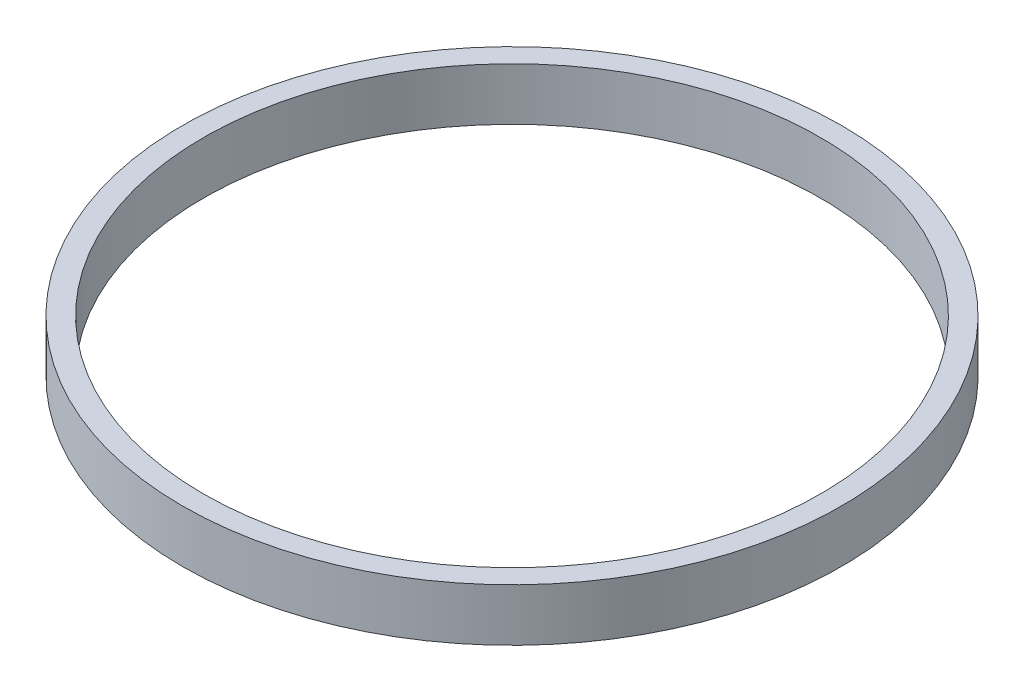
ISO-10303-21;
HEADER;
FILE_DESCRIPTION(('STEP AP214'),'2;1');
FILE_NAME('part.step','',(''),(''),'','','');
FILE_SCHEMA(('AUTOMOTIVE_DESIGN { 1 0 10303 214 1 1 1 1 }'));
ENDSEC;
DATA;
#1=APPLICATION_CONTEXT('core data for automotive mechanical design processes');
#2=APPLICATION_PROTOCOL_DEFINITION('international standard','automotive_design',2000,#1);
#3=PRODUCT_CONTEXT('',#1,'mechanical');
#4=PRODUCT('Part','Part','',(#3));
#5=PRODUCT_RELATED_PRODUCT_CATEGORY('part','',(#4));
#6=PRODUCT_DEFINITION_FORMATION('','',#4);
#7=PRODUCT_DEFINITION_CONTEXT('part definition',#1,'design');
#8=PRODUCT_DEFINITION('design','',#6,#7);
#9=PRODUCT_DEFINITION_SHAPE('','',#8);
#10=(LENGTH_UNIT() NAMED_UNIT(*) SI_UNIT(.MILLI.,.METRE.));
#11=(NAMED_UNIT(*) PLANE_ANGLE_UNIT() SI_UNIT($,.RADIAN.));
#12=(NAMED_UNIT(*) SI_UNIT($,.STERADIAN.) SOLID_ANGLE_UNIT());
#13=UNCERTAINTY_MEASURE_WITH_UNIT(LENGTH_MEASURE(1.E-05),#10,'distance_accuracy_value','');
#14=(GEOMETRIC_REPRESENTATION_CONTEXT(3) GLOBAL_UNCERTAINTY_ASSIGNED_CONTEXT((#13)) GLOBAL_UNIT_ASSIGNED_CONTEXT((#10,
#11,#12)) REPRESENTATION_CONTEXT('',''));
#15=CARTESIAN_POINT('',(0.,0.,0.));
#16=DIRECTION('',(0.,0.,1.));
#17=DIRECTION('',(1.,0.,0.));
#18=AXIS2_PLACEMENT_3D('',#15,#16,#17);
#19=CARTESIAN_POINT('',(4.07862578885085,10.,-4.75361348173173));
#20=DIRECTION('',(0.,1.,0.));
#21=DIRECTION('',(0.,0.,1.));
#22=AXIS2_PLACEMENT_3D('',#19,#20,#21);
#23=PLANE('',#22);
#24=CARTESIAN_POINT('',(4.07862578885085,10.,-4.75361348173173));
#25=DIRECTION('',(0.,1.,0.));
#26=DIRECTION('',(0.,0.,1.));
#27=AXIS2_PLACEMENT_3D('',#24,#25,#26);
#28=CIRCLE('',#27,62.8330061942196);
#29=CARTESIAN_POINT('',(4.07862578885085,10.,58.0793927124879));
#30=VERTEX_POINT('',#29);
#31=EDGE_CURVE('E10',#30,#30,#28,.T.);
#32=ORIENTED_EDGE('',*,*,#31,.T.);
#33=EDGE_LOOP('',(#32));
#34=FACE_BOUND('',#33,.T.);
#35=CARTESIAN_POINT('',(4.07862578885085,10.,-4.75361348173173));
#36=DIRECTION('',(0.,1.,0.));
#37=DIRECTION('',(0.,0.,1.));
#38=AXIS2_PLACEMENT_3D('',#35,#36,#37);
#39=CIRCLE('',#38,58.8379999999992);
#40=CARTESIAN_POINT('',(4.07862578885085,10.,54.0843865182675));
#41=VERTEX_POINT('',#40);
#42=EDGE_CURVE('E41',#41,#41,#39,.T.);
#43=ORIENTED_EDGE('',*,*,#42,.F.);
#44=EDGE_LOOP('',(#43));
#45=FACE_BOUND('',#44,.T.);
#46=ADVANCED_FACE('F30',(#34,#45),#23,.T.);
#47=CARTESIAN_POINT('',(4.07862578885085,0.,-4.75361348173173));
#48=DIRECTION('',(0.,1.,0.));
#49=DIRECTION('',(0.,0.,1.));
#50=AXIS2_PLACEMENT_3D('',#47,#48,#49);
#51=PLANE('',#50);
#52=CARTESIAN_POINT('',(4.07862578885085,0.,-4.75361348173173));
#53=DIRECTION('',(0.,1.,0.));
#54=DIRECTION('',(0.,0.,1.));
#55=AXIS2_PLACEMENT_3D('',#52,#53,#54);
#56=CIRCLE('',#55,62.8330061942196);
#57=CARTESIAN_POINT('',(4.07862578885085,0.,58.0793927124879));
#58=VERTEX_POINT('',#57);
#59=EDGE_CURVE('E34',#58,#58,#56,.T.);
#60=ORIENTED_EDGE('',*,*,#59,.F.);
#61=EDGE_LOOP('',(#60));
#62=FACE_BOUND('',#61,.T.);
#63=CARTESIAN_POINT('',(4.07862578885085,0.,-4.75361348173173));
#64=DIRECTION('',(0.,1.,0.));
#65=DIRECTION('',(0.,0.,1.));
#66=AXIS2_PLACEMENT_3D('',#63,#64,#65);
#67=CIRCLE('',#66,58.8379999999992);
#68=CARTESIAN_POINT('',(4.07862578885085,0.,54.0843865182675));
#69=VERTEX_POINT('',#68);
#70=EDGE_CURVE('E43',#69,#69,#67,.T.);
#71=ORIENTED_EDGE('',*,*,#70,.T.);
#72=EDGE_LOOP('',(#71));
#73=FACE_BOUND('',#72,.T.);
#74=ADVANCED_FACE('F53',(#62,#73),#51,.F.);
#75=CARTESIAN_POINT('',(4.07862578885085,10.,-4.75361348173173));
#76=DIRECTION('',(0.,-1.,0.));
#77=DIRECTION('',(0.,0.,-1.));
#78=AXIS2_PLACEMENT_3D('',#75,#76,#77);
#79=CYLINDRICAL_SURFACE('',#78,62.8330061942196);
#80=ORIENTED_EDGE('',*,*,#31,.F.);
#81=EDGE_LOOP('',(#80));
#82=FACE_BOUND('',#81,.T.);
#83=ORIENTED_EDGE('',*,*,#59,.T.);
#84=EDGE_LOOP('',(#83));
#85=FACE_BOUND('',#84,.T.);
#86=ADVANCED_FACE('F32',(#82,#85),#79,.T.);
#87=CARTESIAN_POINT('',(4.07862578885085,10.,-4.75361348173173));
#88=DIRECTION('',(0.,-1.,0.));
#89=DIRECTION('',(0.,0.,-1.));
#90=AXIS2_PLACEMENT_3D('',#87,#88,#89);
#91=CYLINDRICAL_SURFACE('',#90,58.8379999999992);
#92=ORIENTED_EDGE('',*,*,#42,.T.);
#93=EDGE_LOOP('',(#92));
#94=FACE_BOUND('',#93,.T.);
#95=ORIENTED_EDGE('',*,*,#70,.F.);
#96=EDGE_LOOP('',(#95));
#97=FACE_BOUND('',#96,.T.);
#98=ADVANCED_FACE('F49',(#94,#97),#91,.F.);
#99=CLOSED_SHELL('',(#46,#74,#86,#98));
#100=MANIFOLD_SOLID_BREP('B2',#99);
#101=ADVANCED_BREP_SHAPE_REPRESENTATION('',(#18,#100),#14);
#102=SHAPE_DEFINITION_REPRESENTATION(#9,#101);
ENDSEC;
END-ISO-10303-21;
